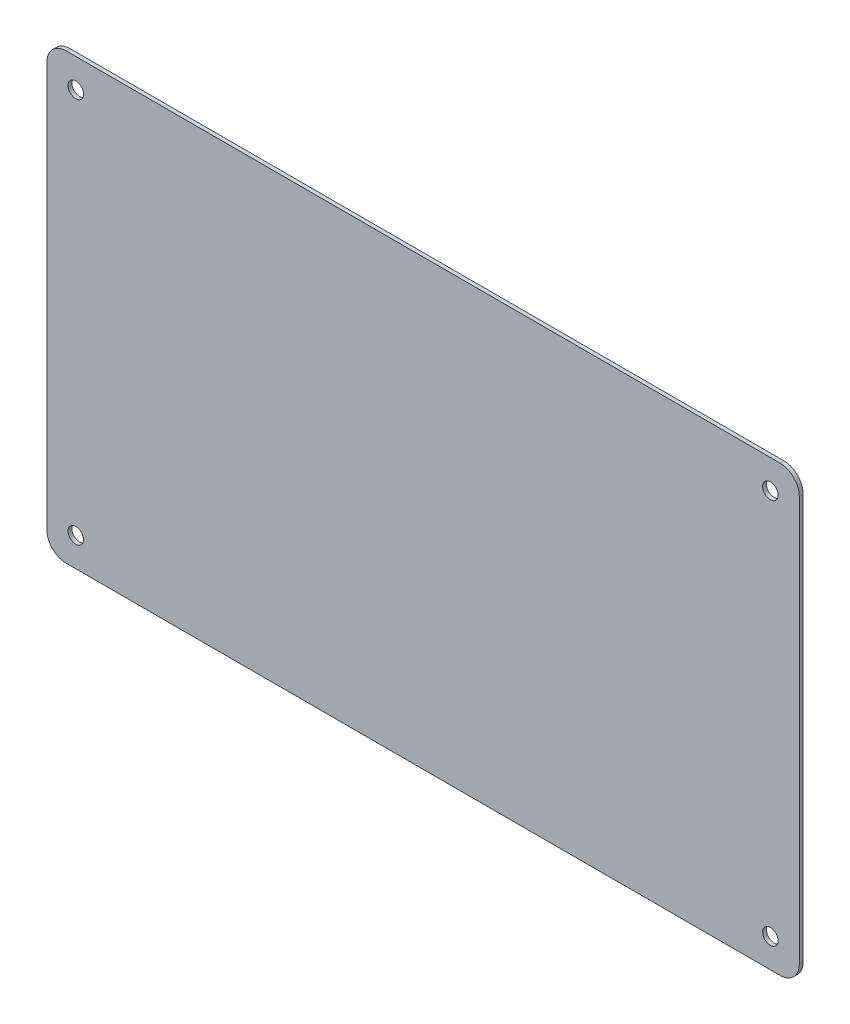
ISO-10303-21;
HEADER;
FILE_DESCRIPTION(('STEP AP214'),'2;1');
FILE_NAME('part.step','',(''),(''),'','','');
FILE_SCHEMA(('AUTOMOTIVE_DESIGN { 1 0 10303 214 1 1 1 1 }'));
ENDSEC;
DATA;
#1=APPLICATION_CONTEXT('core data for automotive mechanical design processes');
#2=APPLICATION_PROTOCOL_DEFINITION('international standard','automotive_design',2000,#1);
#3=PRODUCT_CONTEXT('',#1,'mechanical');
#4=PRODUCT('Part','Part','',(#3));
#5=PRODUCT_RELATED_PRODUCT_CATEGORY('part','',(#4));
#6=PRODUCT_DEFINITION_FORMATION('','',#4);
#7=PRODUCT_DEFINITION_CONTEXT('part definition',#1,'design');
#8=PRODUCT_DEFINITION('design','',#6,#7);
#9=PRODUCT_DEFINITION_SHAPE('','',#8);
#10=(LENGTH_UNIT() NAMED_UNIT(*) SI_UNIT(.MILLI.,.METRE.));
#11=(NAMED_UNIT(*) PLANE_ANGLE_UNIT() SI_UNIT($,.RADIAN.));
#12=(NAMED_UNIT(*) SI_UNIT($,.STERADIAN.) SOLID_ANGLE_UNIT());
#13=UNCERTAINTY_MEASURE_WITH_UNIT(LENGTH_MEASURE(1.E-05),#10,'distance_accuracy_value','');
#14=(GEOMETRIC_REPRESENTATION_CONTEXT(3) GLOBAL_UNCERTAINTY_ASSIGNED_CONTEXT((#13)) GLOBAL_UNIT_ASSIGNED_CONTEXT((#10,
#11,#12)) REPRESENTATION_CONTEXT('',''));
#15=CARTESIAN_POINT('',(0.,0.,0.));
#16=DIRECTION('',(0.,0.,1.));
#17=DIRECTION('',(1.,0.,0.));
#18=AXIS2_PLACEMENT_3D('',#15,#16,#17);
#19=CARTESIAN_POINT('',(-37.,21.,0.4));
#20=DIRECTION('',(0.,0.,-1.));
#21=DIRECTION('',(-1.,0.,0.));
#22=AXIS2_PLACEMENT_3D('',#19,#20,#21);
#23=CYLINDRICAL_SURFACE('',#22,2.);
#24=CARTESIAN_POINT('',(-37.,21.,0.));
#25=DIRECTION('',(0.,0.,1.));
#26=DIRECTION('',(1.,0.,0.));
#27=AXIS2_PLACEMENT_3D('',#24,#25,#26);
#28=CIRCLE('',#27,2.);
#29=CARTESIAN_POINT('',(-37.,23.,0.));
#30=VERTEX_POINT('',#29);
#31=CARTESIAN_POINT('',(-39.,21.,0.));
#32=VERTEX_POINT('',#31);
#33=EDGE_CURVE('E141',#30,#32,#28,.T.);
#34=ORIENTED_EDGE('',*,*,#33,.T.);
#35=DIRECTION('',(0.,0.,-1.));
#36=VECTOR('',#35,1.);
#37=CARTESIAN_POINT('',(-39.,21.,0.4));
#38=LINE('',#37,#36);
#39=CARTESIAN_POINT('',(-39.,21.,0.4));
#40=VERTEX_POINT('',#39);
#41=EDGE_CURVE('E11',#40,#32,#38,.T.);
#42=ORIENTED_EDGE('',*,*,#41,.F.);
#43=CARTESIAN_POINT('',(-37.,21.,0.4));
#44=DIRECTION('',(0.,0.,1.));
#45=DIRECTION('',(1.,0.,0.));
#46=AXIS2_PLACEMENT_3D('',#43,#44,#45);
#47=CIRCLE('',#46,2.);
#48=CARTESIAN_POINT('',(-37.,23.,0.4));
#49=VERTEX_POINT('',#48);
#50=EDGE_CURVE('E163',#49,#40,#47,.T.);
#51=ORIENTED_EDGE('',*,*,#50,.F.);
#52=DIRECTION('',(0.,0.,-1.));
#53=VECTOR('',#52,1.);
#54=CARTESIAN_POINT('',(-37.,23.,0.4));
#55=LINE('',#54,#53);
#56=EDGE_CURVE('E137',#49,#30,#55,.T.);
#57=ORIENTED_EDGE('',*,*,#56,.T.);
#58=EDGE_LOOP('',(#34,#42,#51,#57));
#59=FACE_BOUND('',#58,.T.);
#60=ADVANCED_FACE('F38',(#59),#23,.T.);
#61=CARTESIAN_POINT('',(-39.,21.,0.4));
#62=DIRECTION('',(1.,0.,0.));
#63=DIRECTION('',(0.,0.,-1.));
#64=AXIS2_PLACEMENT_3D('',#61,#62,#63);
#65=PLANE('',#64);
#66=DIRECTION('',(0.,-1.,0.));
#67=VECTOR('',#66,1.);
#68=CARTESIAN_POINT('',(-39.,21.,0.));
#69=LINE('',#68,#67);
#70=CARTESIAN_POINT('',(-39.,-21.,0.));
#71=VERTEX_POINT('',#70);
#72=EDGE_CURVE('E145',#32,#71,#69,.T.);
#73=ORIENTED_EDGE('',*,*,#72,.T.);
#74=DIRECTION('',(0.,0.,-1.));
#75=VECTOR('',#74,1.);
#76=CARTESIAN_POINT('',(-39.,-21.,0.4));
#77=LINE('',#76,#75);
#78=CARTESIAN_POINT('',(-39.,-21.,0.4));
#79=VERTEX_POINT('',#78);
#80=EDGE_CURVE('E48',#79,#71,#77,.T.);
#81=ORIENTED_EDGE('',*,*,#80,.F.);
#82=DIRECTION('',(0.,-1.,0.));
#83=VECTOR('',#82,1.);
#84=CARTESIAN_POINT('',(-39.,21.,0.4));
#85=LINE('',#84,#83);
#86=EDGE_CURVE('E100',#40,#79,#85,.T.);
#87=ORIENTED_EDGE('',*,*,#86,.F.);
#88=ORIENTED_EDGE('',*,*,#41,.T.);
#89=EDGE_LOOP('',(#73,#81,#87,#88));
#90=FACE_BOUND('',#89,.T.);
#91=ADVANCED_FACE('F214',(#90),#65,.F.);
#92=CARTESIAN_POINT('',(-37.,-21.,0.4));
#93=DIRECTION('',(0.,0.,-1.));
#94=DIRECTION('',(-1.,0.,0.));
#95=AXIS2_PLACEMENT_3D('',#92,#93,#94);
#96=CYLINDRICAL_SURFACE('',#95,2.);
#97=CARTESIAN_POINT('',(-37.,-21.,0.));
#98=DIRECTION('',(0.,0.,1.));
#99=DIRECTION('',(1.,0.,0.));
#100=AXIS2_PLACEMENT_3D('',#97,#98,#99);
#101=CIRCLE('',#100,2.);
#102=CARTESIAN_POINT('',(-37.,-23.,0.));
#103=VERTEX_POINT('',#102);
#104=EDGE_CURVE('E148',#71,#103,#101,.T.);
#105=ORIENTED_EDGE('',*,*,#104,.T.);
#106=DIRECTION('',(0.,0.,-1.));
#107=VECTOR('',#106,1.);
#108=CARTESIAN_POINT('',(-37.,-23.,0.4));
#109=LINE('',#108,#107);
#110=CARTESIAN_POINT('',(-37.,-23.,0.4));
#111=VERTEX_POINT('',#110);
#112=EDGE_CURVE('E174',#111,#103,#109,.T.);
#113=ORIENTED_EDGE('',*,*,#112,.F.);
#114=CARTESIAN_POINT('',(-37.,-21.,0.4));
#115=DIRECTION('',(0.,0.,1.));
#116=DIRECTION('',(1.,0.,0.));
#117=AXIS2_PLACEMENT_3D('',#114,#115,#116);
#118=CIRCLE('',#117,2.);
#119=EDGE_CURVE('E229',#79,#111,#118,.T.);
#120=ORIENTED_EDGE('',*,*,#119,.F.);
#121=ORIENTED_EDGE('',*,*,#80,.T.);
#122=EDGE_LOOP('',(#105,#113,#120,#121));
#123=FACE_BOUND('',#122,.T.);
#124=ADVANCED_FACE('F219',(#123),#96,.T.);
#125=CARTESIAN_POINT('',(-37.,-23.,0.4));
#126=DIRECTION('',(0.,1.,0.));
#127=DIRECTION('',(0.,0.,1.));
#128=AXIS2_PLACEMENT_3D('',#125,#126,#127);
#129=PLANE('',#128);
#130=DIRECTION('',(1.,0.,0.));
#131=VECTOR('',#130,1.);
#132=CARTESIAN_POINT('',(-37.,-23.,0.));
#133=LINE('',#132,#131);
#134=CARTESIAN_POINT('',(37.,-23.,0.));
#135=VERTEX_POINT('',#134);
#136=EDGE_CURVE('E151',#103,#135,#133,.T.);
#137=ORIENTED_EDGE('',*,*,#136,.T.);
#138=DIRECTION('',(0.,0.,-1.));
#139=VECTOR('',#138,1.);
#140=CARTESIAN_POINT('',(37.,-23.,0.4));
#141=LINE('',#140,#139);
#142=CARTESIAN_POINT('',(37.,-23.,0.4));
#143=VERTEX_POINT('',#142);
#144=EDGE_CURVE('E170',#143,#135,#141,.T.);
#145=ORIENTED_EDGE('',*,*,#144,.F.);
#146=DIRECTION('',(1.,0.,0.));
#147=VECTOR('',#146,1.);
#148=CARTESIAN_POINT('',(-37.,-23.,0.4));
#149=LINE('',#148,#147);
#150=EDGE_CURVE('E232',#111,#143,#149,.T.);
#151=ORIENTED_EDGE('',*,*,#150,.F.);
#152=ORIENTED_EDGE('',*,*,#112,.T.);
#153=EDGE_LOOP('',(#137,#145,#151,#152));
#154=FACE_BOUND('',#153,.T.);
#155=ADVANCED_FACE('F285',(#154),#129,.F.);
#156=CARTESIAN_POINT('',(37.,-21.,0.4));
#157=DIRECTION('',(0.,0.,-1.));
#158=DIRECTION('',(-1.,0.,0.));
#159=AXIS2_PLACEMENT_3D('',#156,#157,#158);
#160=CYLINDRICAL_SURFACE('',#159,2.);
#161=CARTESIAN_POINT('',(37.,-21.,0.));
#162=DIRECTION('',(0.,0.,1.));
#163=DIRECTION('',(1.,0.,0.));
#164=AXIS2_PLACEMENT_3D('',#161,#162,#163);
#165=CIRCLE('',#164,2.);
#166=CARTESIAN_POINT('',(39.,-21.,0.));
#167=VERTEX_POINT('',#166);
#168=EDGE_CURVE('E154',#135,#167,#165,.T.);
#169=ORIENTED_EDGE('',*,*,#168,.T.);
#170=DIRECTION('',(0.,0.,-1.));
#171=VECTOR('',#170,1.);
#172=CARTESIAN_POINT('',(39.,-21.,0.4));
#173=LINE('',#172,#171);
#174=CARTESIAN_POINT('',(39.,-21.,0.4));
#175=VERTEX_POINT('',#174);
#176=EDGE_CURVE('E130',#175,#167,#173,.T.);
#177=ORIENTED_EDGE('',*,*,#176,.F.);
#178=CARTESIAN_POINT('',(37.,-21.,0.4));
#179=DIRECTION('',(0.,0.,1.));
#180=DIRECTION('',(1.,0.,0.));
#181=AXIS2_PLACEMENT_3D('',#178,#179,#180);
#182=CIRCLE('',#181,2.);
#183=EDGE_CURVE('E119',#143,#175,#182,.T.);
#184=ORIENTED_EDGE('',*,*,#183,.F.);
#185=ORIENTED_EDGE('',*,*,#144,.T.);
#186=EDGE_LOOP('',(#169,#177,#184,#185));
#187=FACE_BOUND('',#186,.T.);
#188=ADVANCED_FACE('F282',(#187),#160,.T.);
#189=CARTESIAN_POINT('',(39.,21.,0.4));
#190=DIRECTION('',(-1.,0.,0.));
#191=DIRECTION('',(0.,0.,1.));
#192=AXIS2_PLACEMENT_3D('',#189,#190,#191);
#193=PLANE('',#192);
#194=DIRECTION('',(0.,1.,0.));
#195=VECTOR('',#194,1.);
#196=CARTESIAN_POINT('',(39.,21.,0.));
#197=LINE('',#196,#195);
#198=CARTESIAN_POINT('',(39.,21.,0.));
#199=VERTEX_POINT('',#198);
#200=EDGE_CURVE('E128',#167,#199,#197,.T.);
#201=ORIENTED_EDGE('',*,*,#200,.T.);
#202=DIRECTION('',(0.,0.,-1.));
#203=VECTOR('',#202,1.);
#204=CARTESIAN_POINT('',(39.,21.,0.4));
#205=LINE('',#204,#203);
#206=CARTESIAN_POINT('',(39.,21.,0.4));
#207=VERTEX_POINT('',#206);
#208=EDGE_CURVE('E125',#207,#199,#205,.T.);
#209=ORIENTED_EDGE('',*,*,#208,.F.);
#210=DIRECTION('',(0.,1.,0.));
#211=VECTOR('',#210,1.);
#212=CARTESIAN_POINT('',(39.,21.,0.4));
#213=LINE('',#212,#211);
#214=EDGE_CURVE('E113',#175,#207,#213,.T.);
#215=ORIENTED_EDGE('',*,*,#214,.F.);
#216=ORIENTED_EDGE('',*,*,#176,.T.);
#217=EDGE_LOOP('',(#201,#209,#215,#216));
#218=FACE_BOUND('',#217,.T.);
#219=ADVANCED_FACE('F126',(#218),#193,.F.);
#220=CARTESIAN_POINT('',(37.,21.,0.4));
#221=DIRECTION('',(0.,0.,-1.));
#222=DIRECTION('',(-1.,0.,0.));
#223=AXIS2_PLACEMENT_3D('',#220,#221,#222);
#224=CYLINDRICAL_SURFACE('',#223,2.);
#225=CARTESIAN_POINT('',(37.,21.,0.));
#226=DIRECTION('',(0.,0.,1.));
#227=DIRECTION('',(-1.,0.,0.));
#228=AXIS2_PLACEMENT_3D('',#225,#226,#227);
#229=CIRCLE('',#228,2.);
#230=CARTESIAN_POINT('',(37.,23.,0.));
#231=VERTEX_POINT('',#230);
#232=EDGE_CURVE('E86',#199,#231,#229,.T.);
#233=ORIENTED_EDGE('',*,*,#232,.T.);
#234=DIRECTION('',(0.,0.,-1.));
#235=VECTOR('',#234,1.);
#236=CARTESIAN_POINT('',(37.,23.,0.4));
#237=LINE('',#236,#235);
#238=CARTESIAN_POINT('',(37.,23.,0.4));
#239=VERTEX_POINT('',#238);
#240=EDGE_CURVE('E131',#239,#231,#237,.T.);
#241=ORIENTED_EDGE('',*,*,#240,.F.);
#242=CARTESIAN_POINT('',(37.,21.,0.4));
#243=DIRECTION('',(0.,0.,1.));
#244=DIRECTION('',(-1.,0.,0.));
#245=AXIS2_PLACEMENT_3D('',#242,#243,#244);
#246=CIRCLE('',#245,2.);
#247=EDGE_CURVE('E117',#207,#239,#246,.T.);
#248=ORIENTED_EDGE('',*,*,#247,.F.);
#249=ORIENTED_EDGE('',*,*,#208,.T.);
#250=EDGE_LOOP('',(#233,#241,#248,#249));
#251=FACE_BOUND('',#250,.T.);
#252=ADVANCED_FACE('F133',(#251),#224,.T.);
#253=CARTESIAN_POINT('',(-37.,23.,0.4));
#254=DIRECTION('',(0.,-1.,0.));
#255=DIRECTION('',(0.,0.,-1.));
#256=AXIS2_PLACEMENT_3D('',#253,#254,#255);
#257=PLANE('',#256);
#258=DIRECTION('',(-1.,0.,0.));
#259=VECTOR('',#258,1.);
#260=CARTESIAN_POINT('',(-37.,23.,0.));
#261=LINE('',#260,#259);
#262=EDGE_CURVE('E92',#231,#30,#261,.T.);
#263=ORIENTED_EDGE('',*,*,#262,.T.);
#264=ORIENTED_EDGE('',*,*,#56,.F.);
#265=DIRECTION('',(-1.,0.,0.));
#266=VECTOR('',#265,1.);
#267=CARTESIAN_POINT('',(-37.,23.,0.4));
#268=LINE('',#267,#266);
#269=EDGE_CURVE('E57',#239,#49,#268,.T.);
#270=ORIENTED_EDGE('',*,*,#269,.F.);
#271=ORIENTED_EDGE('',*,*,#240,.T.);
#272=EDGE_LOOP('',(#263,#264,#270,#271));
#273=FACE_BOUND('',#272,.T.);
#274=ADVANCED_FACE('F261',(#273),#257,.F.);
#275=CARTESIAN_POINT('',(-37.,21.,0.4));
#276=DIRECTION('',(0.,0.,1.));
#277=DIRECTION('',(1.,0.,0.));
#278=AXIS2_PLACEMENT_3D('',#275,#276,#277);
#279=PLANE('',#278);
#280=CARTESIAN_POINT('',(-36.,-20.,0.4));
#281=DIRECTION('',(0.,0.,1.));
#282=DIRECTION('',(1.,0.,0.));
#283=AXIS2_PLACEMENT_3D('',#280,#281,#282);
#284=CIRCLE('',#283,0.800000000000003);
#285=CARTESIAN_POINT('',(-35.2,-20.,0.4));
#286=VERTEX_POINT('',#285);
#287=EDGE_CURVE('E246',#286,#286,#284,.T.);
#288=ORIENTED_EDGE('',*,*,#287,.F.);
#289=EDGE_LOOP('',(#288));
#290=FACE_BOUND('',#289,.T.);
#291=CARTESIAN_POINT('',(36.,-20.,0.4));
#292=DIRECTION('',(0.,0.,1.));
#293=DIRECTION('',(1.,0.,0.));
#294=AXIS2_PLACEMENT_3D('',#291,#292,#293);
#295=CIRCLE('',#294,0.800000000000003);
#296=CARTESIAN_POINT('',(36.8,-20.,0.4));
#297=VERTEX_POINT('',#296);
#298=EDGE_CURVE('E249',#297,#297,#295,.T.);
#299=ORIENTED_EDGE('',*,*,#298,.F.);
#300=EDGE_LOOP('',(#299));
#301=FACE_BOUND('',#300,.T.);
#302=CARTESIAN_POINT('',(36.,20.,0.4));
#303=DIRECTION('',(0.,0.,1.));
#304=DIRECTION('',(1.,0.,0.));
#305=AXIS2_PLACEMENT_3D('',#302,#303,#304);
#306=CIRCLE('',#305,0.800000000000003);
#307=CARTESIAN_POINT('',(36.8,20.,0.4));
#308=VERTEX_POINT('',#307);
#309=EDGE_CURVE('E245',#308,#308,#306,.T.);
#310=ORIENTED_EDGE('',*,*,#309,.F.);
#311=EDGE_LOOP('',(#310));
#312=FACE_BOUND('',#311,.T.);
#313=CARTESIAN_POINT('',(-36.,20.,0.4));
#314=DIRECTION('',(0.,0.,1.));
#315=DIRECTION('',(1.,0.,0.));
#316=AXIS2_PLACEMENT_3D('',#313,#314,#315);
#317=CIRCLE('',#316,0.800000000000003);
#318=CARTESIAN_POINT('',(-35.2,20.,0.4));
#319=VERTEX_POINT('',#318);
#320=EDGE_CURVE('E186',#319,#319,#317,.T.);
#321=ORIENTED_EDGE('',*,*,#320,.F.);
#322=EDGE_LOOP('',(#321));
#323=FACE_BOUND('',#322,.T.);
#324=ORIENTED_EDGE('',*,*,#50,.T.);
#325=ORIENTED_EDGE('',*,*,#86,.T.);
#326=ORIENTED_EDGE('',*,*,#119,.T.);
#327=ORIENTED_EDGE('',*,*,#150,.T.);
#328=ORIENTED_EDGE('',*,*,#183,.T.);
#329=ORIENTED_EDGE('',*,*,#214,.T.);
#330=ORIENTED_EDGE('',*,*,#247,.T.);
#331=ORIENTED_EDGE('',*,*,#269,.T.);
#332=EDGE_LOOP('',(#324,#325,#326,#327,#328,#329,#330,#331));
#333=FACE_BOUND('',#332,.T.);
#334=ADVANCED_FACE('F115',(#290,#301,#312,#323,#333),#279,.T.);
#335=CARTESIAN_POINT('',(-37.,21.,0.));
#336=DIRECTION('',(0.,0.,1.));
#337=DIRECTION('',(1.,0.,0.));
#338=AXIS2_PLACEMENT_3D('',#335,#336,#337);
#339=PLANE('',#338);
#340=CARTESIAN_POINT('',(-36.,-20.,0.));
#341=DIRECTION('',(0.,0.,1.));
#342=DIRECTION('',(1.,0.,0.));
#343=AXIS2_PLACEMENT_3D('',#340,#341,#342);
#344=CIRCLE('',#343,0.800000000000003);
#345=CARTESIAN_POINT('',(-35.2,-20.,0.));
#346=VERTEX_POINT('',#345);
#347=EDGE_CURVE('E41',#346,#346,#344,.T.);
#348=ORIENTED_EDGE('',*,*,#347,.T.);
#349=EDGE_LOOP('',(#348));
#350=FACE_BOUND('',#349,.T.);
#351=CARTESIAN_POINT('',(36.,-20.,0.));
#352=DIRECTION('',(0.,0.,1.));
#353=DIRECTION('',(1.,0.,0.));
#354=AXIS2_PLACEMENT_3D('',#351,#352,#353);
#355=CIRCLE('',#354,0.800000000000003);
#356=CARTESIAN_POINT('',(36.8,-20.,0.));
#357=VERTEX_POINT('',#356);
#358=EDGE_CURVE('E189',#357,#357,#355,.T.);
#359=ORIENTED_EDGE('',*,*,#358,.T.);
#360=EDGE_LOOP('',(#359));
#361=FACE_BOUND('',#360,.T.);
#362=CARTESIAN_POINT('',(36.,20.,0.));
#363=DIRECTION('',(0.,0.,1.));
#364=DIRECTION('',(1.,0.,0.));
#365=AXIS2_PLACEMENT_3D('',#362,#363,#364);
#366=CIRCLE('',#365,0.800000000000003);
#367=CARTESIAN_POINT('',(36.8,20.,0.));
#368=VERTEX_POINT('',#367);
#369=EDGE_CURVE('E185',#368,#368,#366,.T.);
#370=ORIENTED_EDGE('',*,*,#369,.T.);
#371=EDGE_LOOP('',(#370));
#372=FACE_BOUND('',#371,.T.);
#373=CARTESIAN_POINT('',(-36.,20.,0.));
#374=DIRECTION('',(0.,0.,1.));
#375=DIRECTION('',(1.,0.,0.));
#376=AXIS2_PLACEMENT_3D('',#373,#374,#375);
#377=CIRCLE('',#376,0.800000000000003);
#378=CARTESIAN_POINT('',(-35.2,20.,0.));
#379=VERTEX_POINT('',#378);
#380=EDGE_CURVE('E181',#379,#379,#377,.T.);
#381=ORIENTED_EDGE('',*,*,#380,.T.);
#382=EDGE_LOOP('',(#381));
#383=FACE_BOUND('',#382,.T.);
#384=ORIENTED_EDGE('',*,*,#33,.F.);
#385=ORIENTED_EDGE('',*,*,#262,.F.);
#386=ORIENTED_EDGE('',*,*,#232,.F.);
#387=ORIENTED_EDGE('',*,*,#200,.F.);
#388=ORIENTED_EDGE('',*,*,#168,.F.);
#389=ORIENTED_EDGE('',*,*,#136,.F.);
#390=ORIENTED_EDGE('',*,*,#104,.F.);
#391=ORIENTED_EDGE('',*,*,#72,.F.);
#392=EDGE_LOOP('',(#384,#385,#386,#387,#388,#389,#390,#391));
#393=FACE_BOUND('',#392,.T.);
#394=ADVANCED_FACE('F198',(#350,#361,#372,#383,#393),#339,.F.);
#395=CARTESIAN_POINT('',(-36.,20.,-0.6));
#396=DIRECTION('',(0.,0.,1.));
#397=DIRECTION('',(1.,0.,0.));
#398=AXIS2_PLACEMENT_3D('',#395,#396,#397);
#399=CYLINDRICAL_SURFACE('',#398,0.800000000000003);
#400=ORIENTED_EDGE('',*,*,#320,.T.);
#401=EDGE_LOOP('',(#400));
#402=FACE_BOUND('',#401,.T.);
#403=ORIENTED_EDGE('',*,*,#380,.F.);
#404=EDGE_LOOP('',(#403));
#405=FACE_BOUND('',#404,.T.);
#406=ADVANCED_FACE('F266',(#402,#405),#399,.F.);
#407=CARTESIAN_POINT('',(36.,20.,-0.6));
#408=DIRECTION('',(0.,0.,1.));
#409=DIRECTION('',(1.,0.,0.));
#410=AXIS2_PLACEMENT_3D('',#407,#408,#409);
#411=CYLINDRICAL_SURFACE('',#410,0.800000000000003);
#412=ORIENTED_EDGE('',*,*,#309,.T.);
#413=EDGE_LOOP('',(#412));
#414=FACE_BOUND('',#413,.T.);
#415=ORIENTED_EDGE('',*,*,#369,.F.);
#416=EDGE_LOOP('',(#415));
#417=FACE_BOUND('',#416,.T.);
#418=ADVANCED_FACE('F208',(#414,#417),#411,.F.);
#419=CARTESIAN_POINT('',(36.,-20.,-0.6));
#420=DIRECTION('',(0.,0.,1.));
#421=DIRECTION('',(1.,0.,0.));
#422=AXIS2_PLACEMENT_3D('',#419,#420,#421);
#423=CYLINDRICAL_SURFACE('',#422,0.800000000000003);
#424=ORIENTED_EDGE('',*,*,#298,.T.);
#425=EDGE_LOOP('',(#424));
#426=FACE_BOUND('',#425,.T.);
#427=ORIENTED_EDGE('',*,*,#358,.F.);
#428=EDGE_LOOP('',(#427));
#429=FACE_BOUND('',#428,.T.);
#430=ADVANCED_FACE('F202',(#426,#429),#423,.F.);
#431=CARTESIAN_POINT('',(-36.,-20.,-0.6));
#432=DIRECTION('',(0.,0.,1.));
#433=DIRECTION('',(1.,0.,0.));
#434=AXIS2_PLACEMENT_3D('',#431,#432,#433);
#435=CYLINDRICAL_SURFACE('',#434,0.800000000000003);
#436=ORIENTED_EDGE('',*,*,#287,.T.);
#437=EDGE_LOOP('',(#436));
#438=FACE_BOUND('',#437,.T.);
#439=ORIENTED_EDGE('',*,*,#347,.F.);
#440=EDGE_LOOP('',(#439));
#441=FACE_BOUND('',#440,.T.);
#442=ADVANCED_FACE('F200',(#438,#441),#435,.F.);
#443=CLOSED_SHELL('',(#60,#91,#124,#155,#188,#219,#252,#274,#334,#394,#406,#418,#430,#442));
#444=MANIFOLD_SOLID_BREP('B2',#443);
#445=ADVANCED_BREP_SHAPE_REPRESENTATION('',(#18,#444),#14);
#446=SHAPE_DEFINITION_REPRESENTATION(#9,#445);
ENDSEC;
END-ISO-10303-21;
